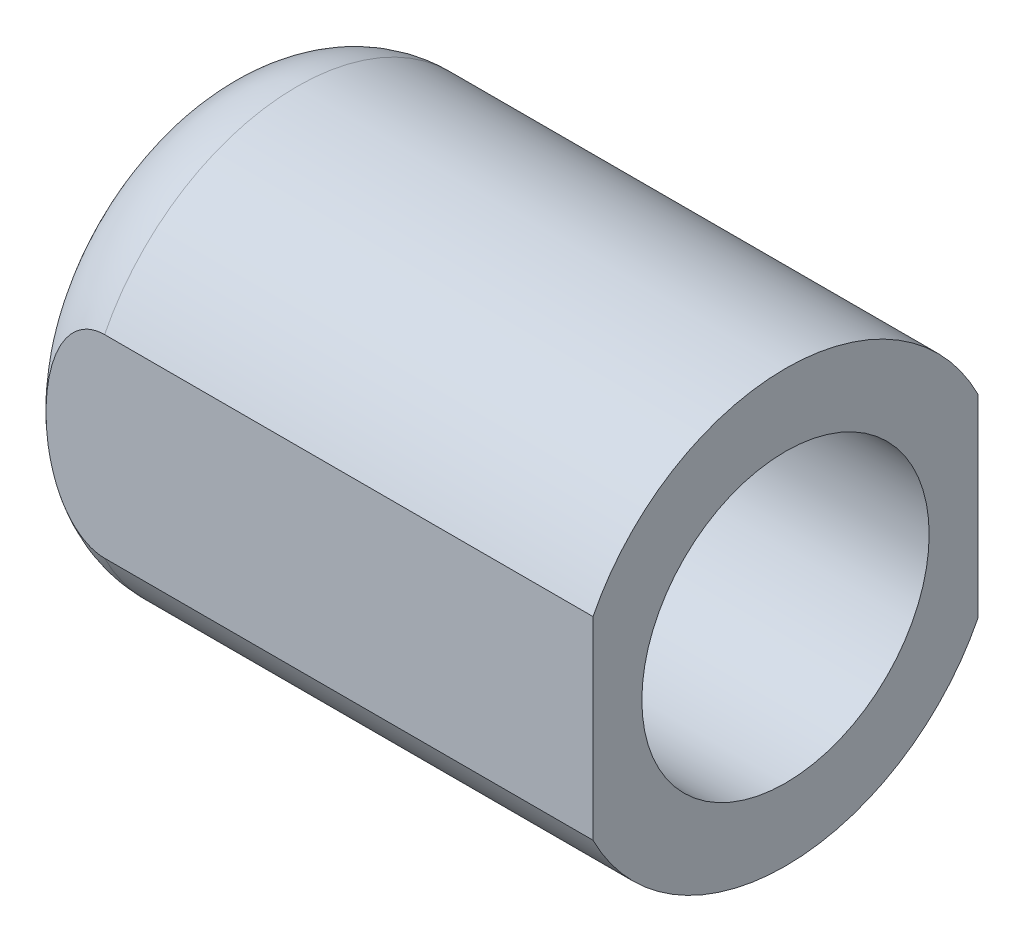
ISO-10303-21;
HEADER;
FILE_DESCRIPTION(('STEP AP214'),'2;1');
FILE_NAME('part.step','',(''),(''),'','','');
FILE_SCHEMA(('AUTOMOTIVE_DESIGN { 1 0 10303 214 1 1 1 1 }'));
ENDSEC;
DATA;
#1=APPLICATION_CONTEXT('core data for automotive mechanical design processes');
#2=APPLICATION_PROTOCOL_DEFINITION('international standard','automotive_design',2000,#1);
#3=PRODUCT_CONTEXT('',#1,'mechanical');
#4=PRODUCT('Part','Part','',(#3));
#5=PRODUCT_RELATED_PRODUCT_CATEGORY('part','',(#4));
#6=PRODUCT_DEFINITION_FORMATION('','',#4);
#7=PRODUCT_DEFINITION_CONTEXT('part definition',#1,'design');
#8=PRODUCT_DEFINITION('design','',#6,#7);
#9=PRODUCT_DEFINITION_SHAPE('','',#8);
#10=(LENGTH_UNIT() NAMED_UNIT(*) SI_UNIT(.MILLI.,.METRE.));
#11=(NAMED_UNIT(*) PLANE_ANGLE_UNIT() SI_UNIT($,.RADIAN.));
#12=(NAMED_UNIT(*) SI_UNIT($,.STERADIAN.) SOLID_ANGLE_UNIT());
#13=UNCERTAINTY_MEASURE_WITH_UNIT(LENGTH_MEASURE(1.E-05),#10,'distance_accuracy_value','');
#14=(GEOMETRIC_REPRESENTATION_CONTEXT(3) GLOBAL_UNCERTAINTY_ASSIGNED_CONTEXT((#13)) GLOBAL_UNIT_ASSIGNED_CONTEXT((#10,
#11,#12)) REPRESENTATION_CONTEXT('',''));
#15=CARTESIAN_POINT('',(0.,0.,0.));
#16=DIRECTION('',(0.,0.,1.));
#17=DIRECTION('',(1.,0.,0.));
#18=AXIS2_PLACEMENT_3D('',#15,#16,#17);
#19=CARTESIAN_POINT('',(-2.,0.,0.));
#20=DIRECTION('',(-1.,0.,0.));
#21=DIRECTION('',(0.,0.,1.));
#22=AXIS2_PLACEMENT_3D('',#19,#20,#21);
#23=CYLINDRICAL_SURFACE('',#22,7.5);
#24=DIRECTION('',(-1.,0.,0.));
#25=VECTOR('',#24,1.);
#26=CARTESIAN_POINT('',(-2.,3.37045990927054,6.7));
#27=LINE('',#26,#25);
#28=CARTESIAN_POINT('',(18.,3.37045990927054,6.7));
#29=VERTEX_POINT('',#28);
#30=CARTESIAN_POINT('',(1.,3.37045990927054,6.7));
#31=VERTEX_POINT('',#30);
#32=EDGE_CURVE('E165',#29,#31,#27,.T.);
#33=ORIENTED_EDGE('',*,*,#32,.F.);
#34=CARTESIAN_POINT('',(18.,0.,0.));
#35=DIRECTION('',(-1.,0.,0.));
#36=DIRECTION('',(0.,0.,1.));
#37=AXIS2_PLACEMENT_3D('',#34,#35,#36);
#38=CIRCLE('',#37,7.5);
#39=CARTESIAN_POINT('',(18.,3.37045990927055,-6.7));
#40=VERTEX_POINT('',#39);
#41=EDGE_CURVE('E168',#29,#40,#38,.T.);
#42=ORIENTED_EDGE('',*,*,#41,.T.);
#43=DIRECTION('',(-1.,0.,0.));
#44=VECTOR('',#43,1.);
#45=CARTESIAN_POINT('',(-2.,3.37045990927054,-6.7));
#46=LINE('',#45,#44);
#47=CARTESIAN_POINT('',(1.,3.37045990927054,-6.7));
#48=VERTEX_POINT('',#47);
#49=EDGE_CURVE('E159',#48,#40,#46,.F.);
#50=ORIENTED_EDGE('',*,*,#49,.F.);
#51=CARTESIAN_POINT('',(1.,0.,0.));
#52=DIRECTION('',(1.,0.,0.));
#53=DIRECTION('',(0.,0.,-1.));
#54=AXIS2_PLACEMENT_3D('',#51,#52,#53);
#55=CIRCLE('',#54,7.5);
#56=EDGE_CURVE('E181',#48,#31,#55,.T.);
#57=ORIENTED_EDGE('',*,*,#56,.T.);
#58=EDGE_LOOP('',(#33,#42,#50,#57));
#59=FACE_BOUND('',#58,.T.);
#60=ADVANCED_FACE('F48',(#59),#23,.T.);
#61=DIRECTION('',(-1.,0.,0.));
#62=VECTOR('',#61,1.);
#63=CARTESIAN_POINT('',(-2.,-3.37045990927054,6.7));
#64=LINE('',#63,#62);
#65=CARTESIAN_POINT('',(1.,-3.37045990927054,6.7));
#66=VERTEX_POINT('',#65);
#67=CARTESIAN_POINT('',(18.,-3.37045990927054,6.7));
#68=VERTEX_POINT('',#67);
#69=EDGE_CURVE('E163',#66,#68,#64,.F.);
#70=ORIENTED_EDGE('',*,*,#69,.F.);
#71=CARTESIAN_POINT('',(1.,-3.37045990927054,-6.7));
#72=VERTEX_POINT('',#71);
#73=EDGE_CURVE('E180',#66,#72,#55,.T.);
#74=ORIENTED_EDGE('',*,*,#73,.T.);
#75=DIRECTION('',(-1.,0.,0.));
#76=VECTOR('',#75,1.);
#77=CARTESIAN_POINT('',(-2.,-3.37045990927054,-6.7));
#78=LINE('',#77,#76);
#79=CARTESIAN_POINT('',(18.,-3.37045990927055,-6.7));
#80=VERTEX_POINT('',#79);
#81=EDGE_CURVE('E161',#80,#72,#78,.T.);
#82=ORIENTED_EDGE('',*,*,#81,.F.);
#83=EDGE_CURVE('E167',#80,#68,#38,.T.);
#84=ORIENTED_EDGE('',*,*,#83,.T.);
#85=EDGE_LOOP('',(#70,#74,#82,#84));
#86=FACE_BOUND('',#85,.T.);
#87=ADVANCED_FACE('F202',(#86),#23,.T.);
#88=CARTESIAN_POINT('',(18.,7.5,0.));
#89=DIRECTION('',(-1.,0.,0.));
#90=DIRECTION('',(0.,0.,1.));
#91=AXIS2_PLACEMENT_3D('',#88,#89,#90);
#92=PLANE('',#91);
#93=CARTESIAN_POINT('',(18.,0.,0.));
#94=DIRECTION('',(-1.,0.,0.));
#95=DIRECTION('',(0.,0.,1.));
#96=AXIS2_PLACEMENT_3D('',#93,#94,#95);
#97=CIRCLE('',#96,5.);
#98=CARTESIAN_POINT('',(18.,0.,5.));
#99=VERTEX_POINT('',#98);
#100=EDGE_CURVE('E171',#99,#99,#97,.T.);
#101=ORIENTED_EDGE('',*,*,#100,.T.);
#102=EDGE_LOOP('',(#101));
#103=FACE_BOUND('',#102,.T.);
#104=DIRECTION('',(0.,-1.,0.));
#105=VECTOR('',#104,1.);
#106=CARTESIAN_POINT('',(18.,-8.72939921670872,6.7));
#107=LINE('',#106,#105);
#108=EDGE_CURVE('E150',#29,#68,#107,.T.);
#109=ORIENTED_EDGE('',*,*,#108,.T.);
#110=ORIENTED_EDGE('',*,*,#83,.F.);
#111=DIRECTION('',(0.,1.,0.));
#112=VECTOR('',#111,1.);
#113=CARTESIAN_POINT('',(18.,-8.72939921670872,-6.7));
#114=LINE('',#113,#112);
#115=EDGE_CURVE('E156',#80,#40,#114,.T.);
#116=ORIENTED_EDGE('',*,*,#115,.T.);
#117=ORIENTED_EDGE('',*,*,#41,.F.);
#118=EDGE_LOOP('',(#109,#110,#116,#117));
#119=FACE_BOUND('',#118,.T.);
#120=ADVANCED_FACE('F199',(#103,#119),#92,.F.);
#121=CARTESIAN_POINT('',(1.,0.,0.));
#122=DIRECTION('',(1.,0.,0.));
#123=DIRECTION('',(0.,0.,-1.));
#124=AXIS2_PLACEMENT_3D('',#121,#122,#123);
#125=TOROIDAL_SURFACE('',#124,4.5,3.);
#126=CARTESIAN_POINT('',(-2.,0.,0.));
#127=DIRECTION('',(1.,0.,0.));
#128=DIRECTION('',(0.,0.,-1.));
#129=AXIS2_PLACEMENT_3D('',#126,#127,#128);
#130=CIRCLE('',#129,4.5);
#131=CARTESIAN_POINT('',(-2.,0.,-4.5));
#132=VERTEX_POINT('',#131);
#133=EDGE_CURVE('E177',#132,#132,#130,.F.);
#134=ORIENTED_EDGE('',*,*,#133,.F.);
#135=EDGE_LOOP('',(#134));
#136=FACE_BOUND('',#135,.T.);
#137=ORIENTED_EDGE('',*,*,#73,.F.);
#138=CARTESIAN_POINT('',(-1.03960780543717,0.,6.7));
#139=CARTESIAN_POINT('',(-1.03960182917097,0.156484034296288,6.7));
#140=CARTESIAN_POINT('',(-1.03372318544004,0.312948833505635,6.7));
#141=CARTESIAN_POINT('',(-1.00983412793796,0.625080453456098,6.7));
#142=CARTESIAN_POINT('',(-0.991816111588025,0.780746712495716,6.7));
#143=CARTESIAN_POINT('',(-0.942661156358213,1.08951517235261,6.7));
#144=CARTESIAN_POINT('',(-0.91156688315573,1.24262404321398,6.7));
#145=CARTESIAN_POINT('',(-0.834522402251524,1.54495542174064,6.7));
#146=CARTESIAN_POINT('',(-0.788591340788891,1.6941826717393,6.7));
#147=CARTESIAN_POINT('',(-0.687099829254367,1.96559527652495,6.7));
#148=CARTESIAN_POINT('',(-0.633818241414326,2.08862143327167,6.7));
#149=CARTESIAN_POINT('',(-0.512452186619495,2.32741744926442,6.7));
#150=CARTESIAN_POINT('',(-0.444357494272509,2.44318222455171,6.7));
#151=CARTESIAN_POINT('',(-0.290335776217987,2.66478440528769,6.7));
#152=CARTESIAN_POINT('',(-0.204177981301819,2.77046469533004,6.7));
#153=CARTESIAN_POINT('',(-0.0132172053579274,2.96340404066786,6.7));
#154=CARTESIAN_POINT('',(0.0915169772152218,3.05072855522557,6.7));
#155=CARTESIAN_POINT('',(0.275015781828921,3.17006193165413,6.7));
#156=CARTESIAN_POINT('',(0.34834914513932,3.21044409872232,6.7));
#157=CARTESIAN_POINT('',(0.500650719872902,3.2787292068231,6.7));
#158=CARTESIAN_POINT('',(0.579614719344579,3.30664136470862,6.7));
#159=CARTESIAN_POINT('',(0.741773611462175,3.34816837281954,6.7));
#160=CARTESIAN_POINT('',(0.824990946323141,3.36169688162085,6.7));
#161=CARTESIAN_POINT('',(0.992494539925126,3.3730421316322,6.7));
#162=CARTESIAN_POINT('',(1.07678051091734,3.37086301632008,6.7));
#163=CARTESIAN_POINT('',(1.23616853946632,3.35187339180119,6.7));
#164=CARTESIAN_POINT('',(1.31143003210374,3.33635668268238,6.7));
#165=CARTESIAN_POINT('',(1.45846209747528,3.29346044320789,6.7));
#166=CARTESIAN_POINT('',(1.53023215203453,3.26607915793266,6.7));
#167=CARTESIAN_POINT('',(1.672190909683,3.19946451312978,6.7));
#168=CARTESIAN_POINT('',(1.74214160188921,3.15972889714081,6.7));
#169=CARTESIAN_POINT('',(1.8758182687567,3.07095414429915,6.7));
#170=CARTESIAN_POINT('',(1.9395408627302,3.0219099966862,6.7));
#171=CARTESIAN_POINT('',(2.09622980578227,2.88517121825232,6.7));
#172=CARTESIAN_POINT('',(2.18422110143052,2.79176476903909,6.7));
#173=CARTESIAN_POINT('',(2.34434203593915,2.59223848908536,6.7));
#174=CARTESIAN_POINT('',(2.41643076665687,2.48608693006759,6.7));
#175=CARTESIAN_POINT('',(2.58256901852117,2.2038300228341,6.7));
#176=CARTESIAN_POINT('',(2.66640870990435,2.02175726337892,6.7));
#177=CARTESIAN_POINT('',(2.80586771333159,1.64712475018566,6.7));
#178=CARTESIAN_POINT('',(2.86140871348616,1.45453751039118,6.7));
#179=CARTESIAN_POINT('',(2.94061048668716,1.10194741500429,6.7));
#180=CARTESIAN_POINT('',(2.96835470506215,0.942827090174376,6.7));
#181=CARTESIAN_POINT('',(3.0102924313302,0.62272203114317,6.7));
#182=CARTESIAN_POINT('',(3.02447626398667,0.461736048573007,6.7));
#183=CARTESIAN_POINT('',(3.04017174335393,0.139039848416689,6.7));
#184=CARTESIAN_POINT('',(3.04167321012632,-0.022670846742532,6.7));
#185=CARTESIAN_POINT('',(3.03207640956479,-0.34565692322631,6.7));
#186=CARTESIAN_POINT('',(3.02098482706931,-0.506932489997646,6.7));
#187=CARTESIAN_POINT('',(2.99069125159851,-0.781005631358505,6.7));
#188=CARTESIAN_POINT('',(2.97481324441231,-0.894176283705888,6.7));
#189=CARTESIAN_POINT('',(2.93589614892778,-1.11927128603373,6.7));
#190=CARTESIAN_POINT('',(2.91285877807232,-1.23119592825376,6.7));
#191=CARTESIAN_POINT('',(2.85898871757167,-1.45288172586314,6.7));
#192=CARTESIAN_POINT('',(2.82817565266399,-1.56264758891109,6.7));
#193=CARTESIAN_POINT('',(2.75783970672559,-1.77931512806841,6.7));
#194=CARTESIAN_POINT('',(2.71832137442491,-1.88621826742693,6.7));
#195=CARTESIAN_POINT('',(2.61927016325596,-2.12002316588893,6.7));
#196=CARTESIAN_POINT('',(2.55722550529186,-2.24588583305737,6.7));
#197=CARTESIAN_POINT('',(2.4160053923385,-2.4877369287361,6.7));
#198=CARTESIAN_POINT('',(2.33684760142225,-2.60373536829376,6.7));
#199=CARTESIAN_POINT('',(2.18113792073102,-2.79360246920087,6.7));
#200=CARTESIAN_POINT('',(2.10870905188708,-2.8708260397256,6.7));
#201=CARTESIAN_POINT('',(1.95253390663337,-3.01289447826348,6.7));
#202=CARTESIAN_POINT('',(1.86880479199874,-3.07775776448062,6.7));
#203=CARTESIAN_POINT('',(1.70892478394213,-3.17932293908461,6.7));
#204=CARTESIAN_POINT('',(1.63471890387025,-3.21907081288103,6.7));
#205=CARTESIAN_POINT('',(1.48072662184475,-3.28577680881088,6.7));
#206=CARTESIAN_POINT('',(1.4009436947713,-3.31274281483619,6.7));
#207=CARTESIAN_POINT('',(1.23731093540394,-3.35207822459382,6.7));
#208=CARTESIAN_POINT('',(1.15344015003212,-3.36436182859513,6.7));
#209=CARTESIAN_POINT('',(0.984882046953443,-3.37300884694923,6.7));
#210=CARTESIAN_POINT('',(0.900194957260533,-3.36937658536979,6.7));
#211=CARTESIAN_POINT('',(0.740834394681697,-3.34760373376184,6.7));
#212=CARTESIAN_POINT('',(0.665964966515994,-3.33085132793325,6.7));
#213=CARTESIAN_POINT('',(0.519871256166623,-3.28566012417693,6.7));
#214=CARTESIAN_POINT('',(0.448647559682091,-3.25721945507531,6.7));
#215=CARTESIAN_POINT('',(0.307320627296989,-3.18836080836477,6.7));
#216=CARTESIAN_POINT('',(0.237503355833742,-3.14736142564378,6.7));
#217=CARTESIAN_POINT('',(0.104233478679454,-3.05614415518188,6.7));
#218=CARTESIAN_POINT('',(0.0407838852421274,-3.00592193603688,6.7));
#219=CARTESIAN_POINT('',(-0.115961103141062,-2.86546728364682,6.7));
#220=CARTESIAN_POINT('',(-0.204059959213513,-2.76942414453706,6.7));
#221=CARTESIAN_POINT('',(-0.36404346044821,-2.56462377941785,6.7));
#222=CARTESIAN_POINT('',(-0.435879220471966,-2.45582967471401,6.7));
#223=CARTESIAN_POINT('',(-0.601560885698642,-2.16596385298354,6.7));
#224=CARTESIAN_POINT('',(-0.684806269525381,-1.97887469396964,6.7));
#225=CARTESIAN_POINT('',(-0.822251069367619,-1.59468459721163,6.7));
#226=CARTESIAN_POINT('',(-0.876416297341391,-1.39757217222727,6.7));
#227=CARTESIAN_POINT('',(-0.960213402633526,-1.00144184151736,6.7));
#228=CARTESIAN_POINT('',(-0.990202011813898,-0.802497182233292,6.7));
#229=CARTESIAN_POINT('',(-1.02991816808109,-0.402359690038374,6.7));
#230=CARTESIAN_POINT('',(-1.03961548806965,-0.201163951341374,6.7));
#231=CARTESIAN_POINT('',(-1.03960780543717,0.,6.7));
#232=B_SPLINE_CURVE_WITH_KNOTS('',3,(#138,#139,#140,#141,#142,#143,#144,#145,#146,#147,#148,
#149,#150,#151,#152,#153,#154,#155,#156,#157,#158,#159,#160,#161,#162,#163,#164,#165,#166,#167,
#168,#169,#170,#171,#172,#173,#174,#175,#176,#177,#178,#179,#180,#181,#182,#183,#184,#185,#186,
#187,#188,#189,#190,#191,#192,#193,#194,#195,#196,#197,#198,#199,#200,#201,#202,#203,#204,#205,
#206,#207,#208,#209,#210,#211,#212,#213,#214,#215,#216,#217,#218,#219,#220,#221,#222,#223,#224,
#225,#226,#227,#228,#229,#230,#231),.UNSPECIFIED.,.T.,.F.,(4,2,2,2,2,2,2,2,2,2,2,2,2,2,2,2,2,2,
2,2,2,2,2,2,2,2,2,2,2,2,2,2,2,2,2,2,2,2,2,2,2,2,2,2,2,2,4),(0.,0.469304393228302,
0.938902973348942,1.40698107509273,1.87445753916488,2.2758550950334,2.67753061734474,
3.08469015299946,3.49037209810108,3.74057137961276,3.9905854262449,4.24209191460961,
4.49353206108801,4.72302363120993,4.95254915760545,5.19300350403628,5.43358765546142,
5.81636237312558,6.20011055550003,6.79810903067047,7.39775349881974,7.88170056049747,
8.36599265776045,8.85067345187417,9.33509708042731,9.67773600737413,10.0202928028413,
10.3619935329653,10.7035161372614,11.1233965583752,11.5428456332504,11.8594135901941,
12.1755060722437,12.4270384623368,12.6784155040066,12.9312544490758,13.1840247063987,
13.4131625865015,13.6423371635827,13.8843420183636,14.1264608200904,14.515211566584,
14.9051157837547,15.5160029765679,16.1276067939942,16.7300120224647,17.3333139922038),.UNSPECIFIED.);
#233=EDGE_CURVE('E12',#66,#31,#232,.T.);
#234=ORIENTED_EDGE('',*,*,#233,.T.);
#235=ORIENTED_EDGE('',*,*,#56,.F.);
#236=CARTESIAN_POINT('',(-1.03960780543717,0.,-6.7));
#237=CARTESIAN_POINT('',(-1.03960182917097,-0.156484034296288,-6.7));
#238=CARTESIAN_POINT('',(-1.03372318544004,-0.312948833505636,-6.7));
#239=CARTESIAN_POINT('',(-1.00983412793797,-0.6250804534561,-6.7));
#240=CARTESIAN_POINT('',(-0.991816111588031,-0.780746712495718,-6.7));
#241=CARTESIAN_POINT('',(-0.942661156358217,-1.08951517235261,-6.7));
#242=CARTESIAN_POINT('',(-0.911566883155731,-1.24262404321398,-6.7));
#243=CARTESIAN_POINT('',(-0.83452240225153,-1.54495542174064,-6.7));
#244=CARTESIAN_POINT('',(-0.788591340788905,-1.6941826717393,-6.7));
#245=CARTESIAN_POINT('',(-0.68709982925438,-1.96559527652495,-6.7));
#246=CARTESIAN_POINT('',(-0.633818241414332,-2.08862143327167,-6.7));
#247=CARTESIAN_POINT('',(-0.512452186619494,-2.32741744926442,-6.7));
#248=CARTESIAN_POINT('',(-0.444357494272509,-2.44318222455171,-6.7));
#249=CARTESIAN_POINT('',(-0.290335776217988,-2.6647844052877,-6.7));
#250=CARTESIAN_POINT('',(-0.204177981301821,-2.77046469533005,-6.7));
#251=CARTESIAN_POINT('',(-0.0132172053579289,-2.96340404066787,-6.7));
#252=CARTESIAN_POINT('',(0.0915169772152218,-3.05072855522557,-6.7));
#253=CARTESIAN_POINT('',(0.275015781828921,-3.17006193165413,-6.7));
#254=CARTESIAN_POINT('',(0.34834914513932,-3.21044409872232,-6.7));
#255=CARTESIAN_POINT('',(0.500650719872902,-3.2787292068231,-6.7));
#256=CARTESIAN_POINT('',(0.579614719344579,-3.30664136470862,-6.7));
#257=CARTESIAN_POINT('',(0.741773611462175,-3.34816837281955,-6.7));
#258=CARTESIAN_POINT('',(0.824990946323142,-3.36169688162085,-6.7));
#259=CARTESIAN_POINT('',(0.992494539925127,-3.37304213163221,-6.7));
#260=CARTESIAN_POINT('',(1.07678051091734,-3.37086301632008,-6.7));
#261=CARTESIAN_POINT('',(1.23616853946632,-3.35187339180119,-6.7));
#262=CARTESIAN_POINT('',(1.31143003210374,-3.33635668268238,-6.7));
#263=CARTESIAN_POINT('',(1.45846209747528,-3.29346044320789,-6.7));
#264=CARTESIAN_POINT('',(1.53023215203453,-3.26607915793266,-6.7));
#265=CARTESIAN_POINT('',(1.672190909683,-3.19946451312978,-6.7));
#266=CARTESIAN_POINT('',(1.74214160188921,-3.15972889714082,-6.7));
#267=CARTESIAN_POINT('',(1.87581826875671,-3.07095414429916,-6.7));
#268=CARTESIAN_POINT('',(1.93954086273021,-3.0219099966862,-6.7));
#269=CARTESIAN_POINT('',(2.09622980578227,-2.88517121825232,-6.7));
#270=CARTESIAN_POINT('',(2.18422110143052,-2.7917647690391,-6.7));
#271=CARTESIAN_POINT('',(2.34434203593916,-2.59223848908536,-6.7));
#272=CARTESIAN_POINT('',(2.41643076665688,-2.4860869300676,-6.7));
#273=CARTESIAN_POINT('',(2.58256901852118,-2.20383002283411,-6.7));
#274=CARTESIAN_POINT('',(2.66640870990436,-2.02175726337892,-6.7));
#275=CARTESIAN_POINT('',(2.80586771333159,-1.64712475018566,-6.7));
#276=CARTESIAN_POINT('',(2.86140871348616,-1.45453751039118,-6.7));
#277=CARTESIAN_POINT('',(2.94061048668716,-1.10194741500429,-6.7));
#278=CARTESIAN_POINT('',(2.96835470506216,-0.942827090174376,-6.7));
#279=CARTESIAN_POINT('',(3.01029243133021,-0.622722031143168,-6.7));
#280=CARTESIAN_POINT('',(3.02447626398667,-0.461736048573004,-6.7));
#281=CARTESIAN_POINT('',(3.04017174335393,-0.139039848416684,-6.7));
#282=CARTESIAN_POINT('',(3.04167321012632,0.0226708467425365,-6.7));
#283=CARTESIAN_POINT('',(3.03207640956479,0.345656923226315,-6.7));
#284=CARTESIAN_POINT('',(3.02098482706933,0.506932489997651,-6.7));
#285=CARTESIAN_POINT('',(2.99069125159853,0.781005631358508,-6.7));
#286=CARTESIAN_POINT('',(2.97481324441232,0.894176283705891,-6.7));
#287=CARTESIAN_POINT('',(2.93589614892778,1.11927128603373,-6.7));
#288=CARTESIAN_POINT('',(2.91285877807232,1.23119592825376,-6.7));
#289=CARTESIAN_POINT('',(2.85898871757168,1.45288172586314,-6.7));
#290=CARTESIAN_POINT('',(2.82817565266399,1.56264758891109,-6.7));
#291=CARTESIAN_POINT('',(2.75783970672559,1.77931512806842,-6.7));
#292=CARTESIAN_POINT('',(2.71832137442491,1.88621826742693,-6.7));
#293=CARTESIAN_POINT('',(2.61927016325596,2.12002316588893,-6.7));
#294=CARTESIAN_POINT('',(2.55722550529186,2.24588583305738,-6.7));
#295=CARTESIAN_POINT('',(2.41600539233851,2.4877369287361,-6.7));
#296=CARTESIAN_POINT('',(2.33684760142225,2.60373536829377,-6.7));
#297=CARTESIAN_POINT('',(2.18113792073102,2.79360246920087,-6.7));
#298=CARTESIAN_POINT('',(2.10870905188708,2.8708260397256,-6.7));
#299=CARTESIAN_POINT('',(1.95253390663337,3.01289447826349,-6.7));
#300=CARTESIAN_POINT('',(1.86880479199874,3.07775776448063,-6.7));
#301=CARTESIAN_POINT('',(1.70892478394213,3.17932293908461,-6.7));
#302=CARTESIAN_POINT('',(1.63471890387025,3.21907081288104,-6.7));
#303=CARTESIAN_POINT('',(1.48072662184475,3.28577680881089,-6.7));
#304=CARTESIAN_POINT('',(1.4009436947713,3.3127428148362,-6.7));
#305=CARTESIAN_POINT('',(1.23731093540394,3.35207822459382,-6.7));
#306=CARTESIAN_POINT('',(1.15344015003212,3.36436182859514,-6.7));
#307=CARTESIAN_POINT('',(0.984882046953443,3.37300884694924,-6.7));
#308=CARTESIAN_POINT('',(0.900194957260534,3.3693765853698,-6.7));
#309=CARTESIAN_POINT('',(0.740834394681697,3.34760373376185,-6.7));
#310=CARTESIAN_POINT('',(0.665964966515994,3.33085132793325,-6.7));
#311=CARTESIAN_POINT('',(0.519871256166623,3.28566012417694,-6.7));
#312=CARTESIAN_POINT('',(0.448647559682091,3.25721945507532,-6.7));
#313=CARTESIAN_POINT('',(0.307320627296989,3.18836080836478,-6.7));
#314=CARTESIAN_POINT('',(0.237503355833742,3.14736142564379,-6.7));
#315=CARTESIAN_POINT('',(0.104233478679454,3.05614415518189,-6.7));
#316=CARTESIAN_POINT('',(0.0407838852421274,3.00592193603689,-6.7));
#317=CARTESIAN_POINT('',(-0.115961103141063,2.86546728364682,-6.7));
#318=CARTESIAN_POINT('',(-0.204059959213514,2.76942414453707,-6.7));
#319=CARTESIAN_POINT('',(-0.364043460448211,2.56462377941786,-6.7));
#320=CARTESIAN_POINT('',(-0.435879220471966,2.45582967471401,-6.7));
#321=CARTESIAN_POINT('',(-0.601560885698642,2.16596385298354,-6.7));
#322=CARTESIAN_POINT('',(-0.684806269525384,1.97887469396964,-6.7));
#323=CARTESIAN_POINT('',(-0.822251069367622,1.59468459721163,-6.7));
#324=CARTESIAN_POINT('',(-0.876416297341391,1.39757217222727,-6.7));
#325=CARTESIAN_POINT('',(-0.960213402633526,1.00144184151737,-6.7));
#326=CARTESIAN_POINT('',(-0.990202011813902,0.802497182233294,-6.7));
#327=CARTESIAN_POINT('',(-1.02991816808109,0.402359690038376,-6.7));
#328=CARTESIAN_POINT('',(-1.03961548806965,0.201163951341374,-6.7));
#329=CARTESIAN_POINT('',(-1.03960780543717,0.,-6.7));
#330=B_SPLINE_CURVE_WITH_KNOTS('',3,(#236,#237,#238,#239,#240,#241,#242,#243,#244,#245,#246,
#247,#248,#249,#250,#251,#252,#253,#254,#255,#256,#257,#258,#259,#260,#261,#262,#263,#264,#265,
#266,#267,#268,#269,#270,#271,#272,#273,#274,#275,#276,#277,#278,#279,#280,#281,#282,#283,#284,
#285,#286,#287,#288,#289,#290,#291,#292,#293,#294,#295,#296,#297,#298,#299,#300,#301,#302,#303,
#304,#305,#306,#307,#308,#309,#310,#311,#312,#313,#314,#315,#316,#317,#318,#319,#320,#321,#322,
#323,#324,#325,#326,#327,#328,#329),.UNSPECIFIED.,.T.,.F.,(4,2,2,2,2,2,2,2,2,2,2,2,2,2,2,2,2,2,
2,2,2,2,2,2,2,2,2,2,2,2,2,2,2,2,2,2,2,2,2,2,2,2,2,2,2,2,4),(0.,0.469304393228303,
0.938902973348945,1.40698107509273,1.87445753916488,2.27585509503341,2.67753061734475,
3.08469015299947,3.49037209810109,3.74057137961277,3.99058542624491,4.24209191460962,
4.49353206108802,4.72302363120994,4.95254915760545,5.19300350403629,5.43358765546143,
5.8163623731256,6.20011055550005,6.79810903067049,7.39775349881976,7.88170056049749,
8.36599265776047,8.85067345187419,9.33509708042732,9.67773600737415,10.0202928028413,
10.3619935329653,10.7035161372614,11.1233965583752,11.5428456332505,11.8594135901942,
12.1755060722437,12.4270384623368,12.6784155040066,12.9312544490758,13.1840247063987,
13.4131625865015,13.6423371635827,13.8843420183636,14.1264608200904,14.515211566584,
14.9051157837548,15.516002976568,16.1276067939943,16.7300120224647,17.3333139922038),.UNSPECIFIED.);
#331=EDGE_CURVE('E60',#48,#72,#330,.T.);
#332=ORIENTED_EDGE('',*,*,#331,.T.);
#333=EDGE_LOOP('',(#137,#234,#235,#332));
#334=FACE_BOUND('',#333,.T.);
#335=ADVANCED_FACE('F50',(#136,#334),#125,.T.);
#336=CARTESIAN_POINT('',(-2.,7.5,0.));
#337=DIRECTION('',(1.,0.,0.));
#338=DIRECTION('',(0.,0.,-1.));
#339=AXIS2_PLACEMENT_3D('',#336,#337,#338);
#340=PLANE('',#339);
#341=CARTESIAN_POINT('',(-2.,0.825,0.));
#342=DIRECTION('',(1.,0.,0.));
#343=DIRECTION('',(0.,0.,-1.));
#344=AXIS2_PLACEMENT_3D('',#341,#342,#343);
#345=CIRCLE('',#344,0.825);
#346=CARTESIAN_POINT('',(-2.,0.160975609756103,-0.489588203658157));
#347=VERTEX_POINT('',#346);
#348=CARTESIAN_POINT('',(-2.,0.160975609756093,0.489588203658143));
#349=VERTEX_POINT('',#348);
#350=EDGE_CURVE('E125',#347,#349,#345,.T.);
#351=ORIENTED_EDGE('',*,*,#350,.T.);
#352=CARTESIAN_POINT('',(-2.,0.,0.608276253029813));
#353=DIRECTION('',(-1.,0.,0.));
#354=DIRECTION('',(0.,0.,-1.));
#355=AXIS2_PLACEMENT_3D('',#352,#353,#354);
#356=CIRCLE('',#355,0.2);
#357=CARTESIAN_POINT('',(-2.,-0.160975609756103,0.489588203658139));
#358=VERTEX_POINT('',#357);
#359=EDGE_CURVE('E119',#349,#358,#356,.T.);
#360=ORIENTED_EDGE('',*,*,#359,.T.);
#361=CARTESIAN_POINT('',(-2.,-0.825,0.));
#362=DIRECTION('',(1.,0.,0.));
#363=DIRECTION('',(0.,0.,-1.));
#364=AXIS2_PLACEMENT_3D('',#361,#362,#363);
#365=CIRCLE('',#364,0.825);
#366=CARTESIAN_POINT('',(-2.,-0.160975609756092,-0.48958820365816));
#367=VERTEX_POINT('',#366);
#368=EDGE_CURVE('E128',#358,#367,#365,.T.);
#369=ORIENTED_EDGE('',*,*,#368,.T.);
#370=CARTESIAN_POINT('',(-2.,0.,-0.608276253029831));
#371=DIRECTION('',(-1.,0.,0.));
#372=DIRECTION('',(0.,0.,1.));
#373=AXIS2_PLACEMENT_3D('',#370,#371,#372);
#374=CIRCLE('',#373,0.2);
#375=EDGE_CURVE('E67',#367,#347,#374,.T.);
#376=ORIENTED_EDGE('',*,*,#375,.T.);
#377=EDGE_LOOP('',(#351,#360,#369,#376));
#378=FACE_BOUND('',#377,.T.);
#379=ORIENTED_EDGE('',*,*,#133,.T.);
#380=EDGE_LOOP('',(#379));
#381=FACE_BOUND('',#380,.T.);
#382=ADVANCED_FACE('F132',(#378,#381),#340,.F.);
#383=CARTESIAN_POINT('',(0.,5.,0.));
#384=DIRECTION('',(-1.,0.,0.));
#385=DIRECTION('',(0.,0.,1.));
#386=AXIS2_PLACEMENT_3D('',#383,#384,#385);
#387=PLANE('',#386);
#388=CARTESIAN_POINT('',(0.,-0.825,0.));
#389=DIRECTION('',(1.,0.,0.));
#390=DIRECTION('',(0.,0.,-1.));
#391=AXIS2_PLACEMENT_3D('',#388,#389,#390);
#392=CIRCLE('',#391,0.825);
#393=CARTESIAN_POINT('',(0.,-0.160975609756103,0.489588203658139));
#394=VERTEX_POINT('',#393);
#395=CARTESIAN_POINT('',(0.,-0.160975609756092,-0.48958820365816));
#396=VERTEX_POINT('',#395);
#397=EDGE_CURVE('E144',#394,#396,#392,.T.);
#398=ORIENTED_EDGE('',*,*,#397,.F.);
#399=CARTESIAN_POINT('',(0.,0.,0.608276253029813));
#400=DIRECTION('',(-1.,0.,0.));
#401=DIRECTION('',(0.,0.,-1.));
#402=AXIS2_PLACEMENT_3D('',#399,#400,#401);
#403=CIRCLE('',#402,0.2);
#404=CARTESIAN_POINT('',(0.,0.160975609756093,0.489588203658143));
#405=VERTEX_POINT('',#404);
#406=EDGE_CURVE('E75',#405,#394,#403,.T.);
#407=ORIENTED_EDGE('',*,*,#406,.F.);
#408=CARTESIAN_POINT('',(0.,0.825,0.));
#409=DIRECTION('',(1.,0.,0.));
#410=DIRECTION('',(0.,0.,-1.));
#411=AXIS2_PLACEMENT_3D('',#408,#409,#410);
#412=CIRCLE('',#411,0.825);
#413=CARTESIAN_POINT('',(0.,0.160975609756103,-0.489588203658157));
#414=VERTEX_POINT('',#413);
#415=EDGE_CURVE('E135',#414,#405,#412,.T.);
#416=ORIENTED_EDGE('',*,*,#415,.F.);
#417=CARTESIAN_POINT('',(0.,0.,-0.608276253029831));
#418=DIRECTION('',(-1.,0.,0.));
#419=DIRECTION('',(0.,0.,1.));
#420=AXIS2_PLACEMENT_3D('',#417,#418,#419);
#421=CIRCLE('',#420,0.2);
#422=EDGE_CURVE('E138',#396,#414,#421,.T.);
#423=ORIENTED_EDGE('',*,*,#422,.F.);
#424=EDGE_LOOP('',(#398,#407,#416,#423));
#425=FACE_BOUND('',#424,.T.);
#426=CARTESIAN_POINT('',(0.,0.,0.));
#427=DIRECTION('',(-1.,0.,0.));
#428=DIRECTION('',(0.,0.,1.));
#429=AXIS2_PLACEMENT_3D('',#426,#427,#428);
#430=CIRCLE('',#429,5.);
#431=CARTESIAN_POINT('',(0.,0.,5.));
#432=VERTEX_POINT('',#431);
#433=EDGE_CURVE('E174',#432,#432,#430,.T.);
#434=ORIENTED_EDGE('',*,*,#433,.F.);
#435=EDGE_LOOP('',(#434));
#436=FACE_BOUND('',#435,.T.);
#437=ADVANCED_FACE('F206',(#425,#436),#387,.F.);
#438=CARTESIAN_POINT('',(-2.,0.,0.));
#439=DIRECTION('',(-1.,0.,0.));
#440=DIRECTION('',(0.,0.,1.));
#441=AXIS2_PLACEMENT_3D('',#438,#439,#440);
#442=CYLINDRICAL_SURFACE('',#441,5.);
#443=ORIENTED_EDGE('',*,*,#100,.F.);
#444=EDGE_LOOP('',(#443));
#445=FACE_BOUND('',#444,.T.);
#446=ORIENTED_EDGE('',*,*,#433,.T.);
#447=EDGE_LOOP('',(#446));
#448=FACE_BOUND('',#447,.T.);
#449=ADVANCED_FACE('F192',(#445,#448),#442,.F.);
#450=CARTESIAN_POINT('',(-2.,-8.72939921670872,-6.7));
#451=DIRECTION('',(0.,0.,-1.));
#452=DIRECTION('',(-1.,0.,0.));
#453=AXIS2_PLACEMENT_3D('',#450,#451,#452);
#454=PLANE('',#453);
#455=ORIENTED_EDGE('',*,*,#81,.T.);
#456=ORIENTED_EDGE('',*,*,#331,.F.);
#457=ORIENTED_EDGE('',*,*,#49,.T.);
#458=ORIENTED_EDGE('',*,*,#115,.F.);
#459=EDGE_LOOP('',(#455,#456,#457,#458));
#460=FACE_BOUND('',#459,.T.);
#461=ADVANCED_FACE('F187',(#460),#454,.T.);
#462=CARTESIAN_POINT('',(-2.,-8.72939921670872,6.7));
#463=DIRECTION('',(0.,0.,1.));
#464=DIRECTION('',(1.,0.,0.));
#465=AXIS2_PLACEMENT_3D('',#462,#463,#464);
#466=PLANE('',#465);
#467=ORIENTED_EDGE('',*,*,#32,.T.);
#468=ORIENTED_EDGE('',*,*,#233,.F.);
#469=ORIENTED_EDGE('',*,*,#69,.T.);
#470=ORIENTED_EDGE('',*,*,#108,.F.);
#471=EDGE_LOOP('',(#467,#468,#469,#470));
#472=FACE_BOUND('',#471,.T.);
#473=ADVANCED_FACE('F191',(#472),#466,.T.);
#474=CARTESIAN_POINT('',(-2.,0.,0.608276253029813));
#475=DIRECTION('',(1.,0.,0.));
#476=DIRECTION('',(0.,0.,-1.));
#477=AXIS2_PLACEMENT_3D('',#474,#475,#476);
#478=CYLINDRICAL_SURFACE('',#477,0.2);
#479=ORIENTED_EDGE('',*,*,#406,.T.);
#480=DIRECTION('',(1.,0.,0.));
#481=VECTOR('',#480,1.);
#482=CARTESIAN_POINT('',(-2.,-0.160975609756103,0.489588203658139));
#483=LINE('',#482,#481);
#484=EDGE_CURVE('E115',#358,#394,#483,.T.);
#485=ORIENTED_EDGE('',*,*,#484,.F.);
#486=ORIENTED_EDGE('',*,*,#359,.F.);
#487=DIRECTION('',(1.,0.,0.));
#488=VECTOR('',#487,1.);
#489=CARTESIAN_POINT('',(-2.,0.160975609756093,0.489588203658143));
#490=LINE('',#489,#488);
#491=EDGE_CURVE('E148',#349,#405,#490,.T.);
#492=ORIENTED_EDGE('',*,*,#491,.T.);
#493=EDGE_LOOP('',(#479,#485,#486,#492));
#494=FACE_BOUND('',#493,.T.);
#495=ADVANCED_FACE('F117',(#494),#478,.T.);
#496=CARTESIAN_POINT('',(-2.,0.825,0.));
#497=DIRECTION('',(1.,0.,0.));
#498=DIRECTION('',(0.,0.,-1.));
#499=AXIS2_PLACEMENT_3D('',#496,#497,#498);
#500=CYLINDRICAL_SURFACE('',#499,0.825);
#501=ORIENTED_EDGE('',*,*,#415,.T.);
#502=ORIENTED_EDGE('',*,*,#491,.F.);
#503=ORIENTED_EDGE('',*,*,#350,.F.);
#504=DIRECTION('',(1.,0.,0.));
#505=VECTOR('',#504,1.);
#506=CARTESIAN_POINT('',(-2.,0.160975609756103,-0.489588203658157));
#507=LINE('',#506,#505);
#508=EDGE_CURVE('E151',#347,#414,#507,.T.);
#509=ORIENTED_EDGE('',*,*,#508,.T.);
#510=EDGE_LOOP('',(#501,#502,#503,#509));
#511=FACE_BOUND('',#510,.T.);
#512=ADVANCED_FACE('F263',(#511),#500,.F.);
#513=CARTESIAN_POINT('',(-2.,0.,-0.608276253029831));
#514=DIRECTION('',(1.,0.,0.));
#515=DIRECTION('',(0.,0.,-1.));
#516=AXIS2_PLACEMENT_3D('',#513,#514,#515);
#517=CYLINDRICAL_SURFACE('',#516,0.2);
#518=ORIENTED_EDGE('',*,*,#422,.T.);
#519=ORIENTED_EDGE('',*,*,#508,.F.);
#520=ORIENTED_EDGE('',*,*,#375,.F.);
#521=DIRECTION('',(1.,0.,0.));
#522=VECTOR('',#521,1.);
#523=CARTESIAN_POINT('',(-2.,-0.160975609756092,-0.48958820365816));
#524=LINE('',#523,#522);
#525=EDGE_CURVE('E124',#367,#396,#524,.T.);
#526=ORIENTED_EDGE('',*,*,#525,.T.);
#527=EDGE_LOOP('',(#518,#519,#520,#526));
#528=FACE_BOUND('',#527,.T.);
#529=ADVANCED_FACE('F269',(#528),#517,.T.);
#530=CARTESIAN_POINT('',(-2.,-0.825,0.));
#531=DIRECTION('',(1.,0.,0.));
#532=DIRECTION('',(0.,0.,-1.));
#533=AXIS2_PLACEMENT_3D('',#530,#531,#532);
#534=CYLINDRICAL_SURFACE('',#533,0.825);
#535=ORIENTED_EDGE('',*,*,#397,.T.);
#536=ORIENTED_EDGE('',*,*,#525,.F.);
#537=ORIENTED_EDGE('',*,*,#368,.F.);
#538=ORIENTED_EDGE('',*,*,#484,.T.);
#539=EDGE_LOOP('',(#535,#536,#537,#538));
#540=FACE_BOUND('',#539,.T.);
#541=ADVANCED_FACE('F129',(#540),#534,.F.);
#542=CLOSED_SHELL('',(#60,#87,#120,#335,#382,#437,#449,#461,#473,#495,#512,#529,#541));
#543=MANIFOLD_SOLID_BREP('B2',#542);
#544=ADVANCED_BREP_SHAPE_REPRESENTATION('',(#18,#543),#14);
#545=SHAPE_DEFINITION_REPRESENTATION(#9,#544);
ENDSEC;
END-ISO-10303-21;
